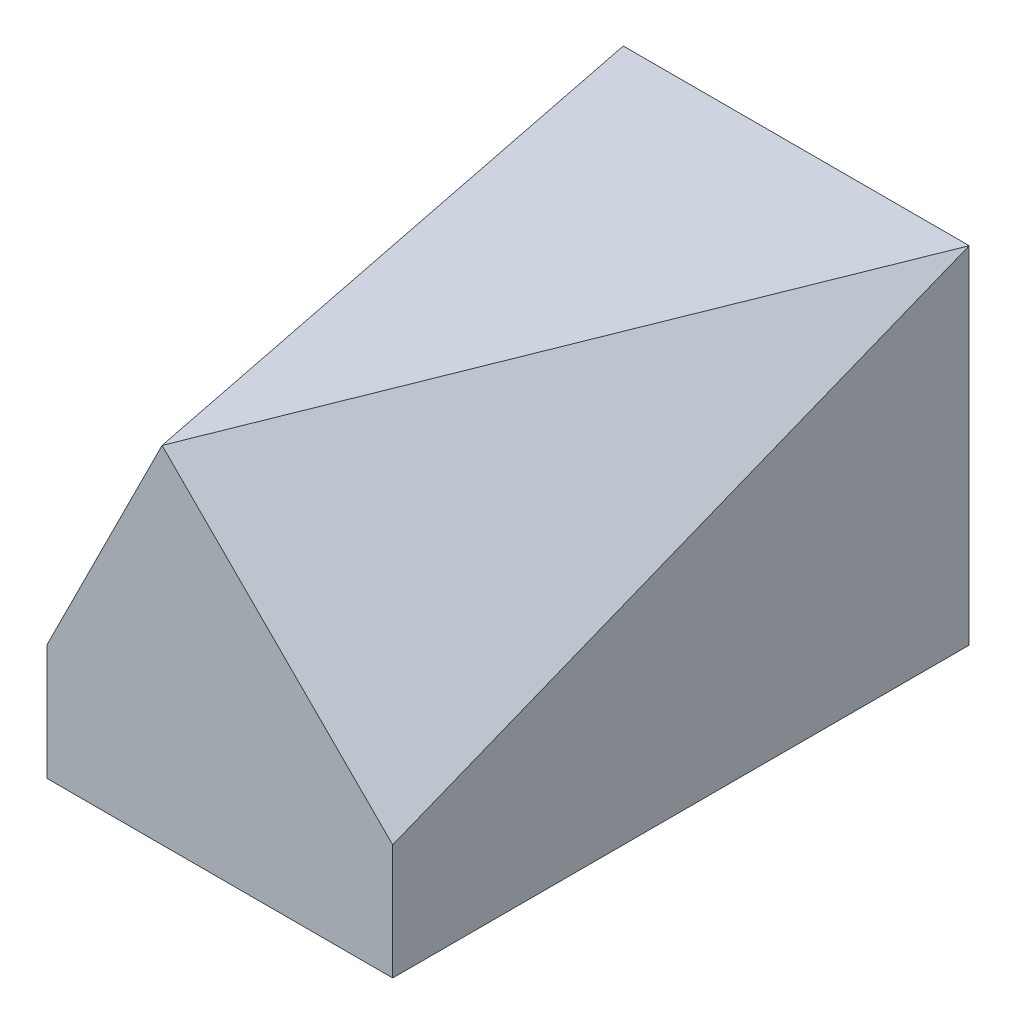
ISO-10303-21;
HEADER;
FILE_DESCRIPTION(('STEP AP214'),'2;1');
FILE_NAME('part.step','',(''),(''),'','','');
FILE_SCHEMA(('AUTOMOTIVE_DESIGN { 1 0 10303 214 1 1 1 1 }'));
ENDSEC;
DATA;
#1=APPLICATION_CONTEXT('core data for automotive mechanical design processes');
#2=APPLICATION_PROTOCOL_DEFINITION('international standard','automotive_design',2000,#1);
#3=PRODUCT_CONTEXT('',#1,'mechanical');
#4=PRODUCT('Part','Part','',(#3));
#5=PRODUCT_RELATED_PRODUCT_CATEGORY('part','',(#4));
#6=PRODUCT_DEFINITION_FORMATION('','',#4);
#7=PRODUCT_DEFINITION_CONTEXT('part definition',#1,'design');
#8=PRODUCT_DEFINITION('design','',#6,#7);
#9=PRODUCT_DEFINITION_SHAPE('','',#8);
#10=(LENGTH_UNIT() NAMED_UNIT(*) SI_UNIT(.MILLI.,.METRE.));
#11=(NAMED_UNIT(*) PLANE_ANGLE_UNIT() SI_UNIT($,.RADIAN.));
#12=(NAMED_UNIT(*) SI_UNIT($,.STERADIAN.) SOLID_ANGLE_UNIT());
#13=UNCERTAINTY_MEASURE_WITH_UNIT(LENGTH_MEASURE(1.E-05),#10,'distance_accuracy_value','');
#14=(GEOMETRIC_REPRESENTATION_CONTEXT(3) GLOBAL_UNCERTAINTY_ASSIGNED_CONTEXT((#13)) GLOBAL_UNIT_ASSIGNED_CONTEXT((#10,
#11,#12)) REPRESENTATION_CONTEXT('',''));
#15=CARTESIAN_POINT('',(0.,0.,0.));
#16=DIRECTION('',(0.,0.,1.));
#17=DIRECTION('',(1.,0.,0.));
#18=AXIS2_PLACEMENT_3D('',#15,#16,#17);
#19=CARTESIAN_POINT('',(-15.,30.,25.));
#20=DIRECTION('',(0.,0.,-1.));
#21=DIRECTION('',(-1.,0.,0.));
#22=AXIS2_PLACEMENT_3D('',#19,#20,#21);
#23=PLANE('',#22);
#24=DIRECTION('',(0.707106781186547,-0.707106781186547,0.));
#25=VECTOR('',#24,1.);
#26=CARTESIAN_POINT('',(-9.99999999999999,35.,25.));
#27=LINE('',#26,#25);
#28=CARTESIAN_POINT('',(-5.,30.,25.));
#29=VERTEX_POINT('',#28);
#30=CARTESIAN_POINT('',(15.,10.,25.));
#31=VERTEX_POINT('',#30);
#32=EDGE_CURVE('E110',#29,#31,#27,.T.);
#33=ORIENTED_EDGE('',*,*,#32,.F.);
#34=DIRECTION('',(-0.447213595499958,-0.894427190999916,0.));
#35=VECTOR('',#34,1.);
#36=CARTESIAN_POINT('',(-7.,26.,25.));
#37=LINE('',#36,#35);
#38=CARTESIAN_POINT('',(-15.,10.,25.));
#39=VERTEX_POINT('',#38);
#40=EDGE_CURVE('E11',#29,#39,#37,.T.);
#41=ORIENTED_EDGE('',*,*,#40,.T.);
#42=DIRECTION('',(0.,-1.,0.));
#43=VECTOR('',#42,1.);
#44=CARTESIAN_POINT('',(-15.,30.,25.));
#45=LINE('',#44,#43);
#46=CARTESIAN_POINT('',(-15.,0.,25.));
#47=VERTEX_POINT('',#46);
#48=EDGE_CURVE('E76',#39,#47,#45,.T.);
#49=ORIENTED_EDGE('',*,*,#48,.T.);
#50=DIRECTION('',(1.,0.,0.));
#51=VECTOR('',#50,1.);
#52=CARTESIAN_POINT('',(-15.,0.,25.));
#53=LINE('',#52,#51);
#54=CARTESIAN_POINT('',(15.,0.,25.));
#55=VERTEX_POINT('',#54);
#56=EDGE_CURVE('E81',#47,#55,#53,.T.);
#57=ORIENTED_EDGE('',*,*,#56,.T.);
#58=DIRECTION('',(0.,-1.,0.));
#59=VECTOR('',#58,1.);
#60=CARTESIAN_POINT('',(15.,30.,25.));
#61=LINE('',#60,#59);
#62=EDGE_CURVE('E85',#31,#55,#61,.T.);
#63=ORIENTED_EDGE('',*,*,#62,.F.);
#64=EDGE_LOOP('',(#33,#41,#49,#57,#63));
#65=FACE_BOUND('',#64,.T.);
#66=ADVANCED_FACE('F36',(#65),#23,.F.);
#67=CARTESIAN_POINT('',(-15.,30.,-25.));
#68=DIRECTION('',(1.,0.,0.));
#69=DIRECTION('',(0.,0.,-1.));
#70=AXIS2_PLACEMENT_3D('',#67,#68,#69);
#71=PLANE('',#70);
#72=ORIENTED_EDGE('',*,*,#48,.F.);
#73=DIRECTION('',(0.,0.371390676354104,-0.928476690885259));
#74=VECTOR('',#73,1.);
#75=CARTESIAN_POINT('',(-15.,30.,-25.));
#76=LINE('',#75,#74);
#77=CARTESIAN_POINT('',(-15.,30.,-25.));
#78=VERTEX_POINT('',#77);
#79=EDGE_CURVE('E44',#39,#78,#76,.T.);
#80=ORIENTED_EDGE('',*,*,#79,.T.);
#81=DIRECTION('',(0.,-1.,0.));
#82=VECTOR('',#81,1.);
#83=CARTESIAN_POINT('',(-15.,30.,-25.));
#84=LINE('',#83,#82);
#85=CARTESIAN_POINT('',(-15.,0.,-25.));
#86=VERTEX_POINT('',#85);
#87=EDGE_CURVE('E84',#78,#86,#84,.T.);
#88=ORIENTED_EDGE('',*,*,#87,.T.);
#89=DIRECTION('',(0.,0.,1.));
#90=VECTOR('',#89,1.);
#91=CARTESIAN_POINT('',(-15.,0.,-25.));
#92=LINE('',#91,#90);
#93=EDGE_CURVE('E89',#86,#47,#92,.T.);
#94=ORIENTED_EDGE('',*,*,#93,.T.);
#95=EDGE_LOOP('',(#72,#80,#88,#94));
#96=FACE_BOUND('',#95,.T.);
#97=ADVANCED_FACE('F90',(#96),#71,.F.);
#98=CARTESIAN_POINT('',(0.,30.,0.));
#99=DIRECTION('',(0.,1.,0.));
#100=DIRECTION('',(0.,0.,1.));
#101=AXIS2_PLACEMENT_3D('',#98,#99,#100);
#102=PLANE('',#101);
#103=DIRECTION('',(-0.196116135138184,0.,-0.98058067569092));
#104=VECTOR('',#103,1.);
#105=CARTESIAN_POINT('',(-9.61538461538461,30.,1.92307692307692));
#106=LINE('',#105,#104);
#107=EDGE_CURVE('E114',#29,#78,#106,.T.);
#108=ORIENTED_EDGE('',*,*,#107,.F.);
#109=DIRECTION('',(0.371390676354104,0.,-0.928476690885259));
#110=VECTOR('',#109,1.);
#111=CARTESIAN_POINT('',(4.31034482758622,30.,1.72413793103449));
#112=LINE('',#111,#110);
#113=CARTESIAN_POINT('',(15.,30.,-25.));
#114=VERTEX_POINT('',#113);
#115=EDGE_CURVE('E112',#29,#114,#112,.T.);
#116=ORIENTED_EDGE('',*,*,#115,.T.);
#117=DIRECTION('',(-1.,0.,0.));
#118=VECTOR('',#117,1.);
#119=CARTESIAN_POINT('',(-15.,30.,-25.));
#120=LINE('',#119,#118);
#121=EDGE_CURVE('E98',#114,#78,#120,.T.);
#122=ORIENTED_EDGE('',*,*,#121,.T.);
#123=EDGE_LOOP('',(#108,#116,#122));
#124=FACE_BOUND('',#123,.T.);
#125=ADVANCED_FACE('F120',(#124),#102,.T.);
#126=CARTESIAN_POINT('',(15.,30.,-25.));
#127=DIRECTION('',(-1.,0.,0.));
#128=DIRECTION('',(0.,0.,1.));
#129=AXIS2_PLACEMENT_3D('',#126,#127,#128);
#130=PLANE('',#129);
#131=DIRECTION('',(0.,0.371390676354104,-0.928476690885259));
#132=VECTOR('',#131,1.);
#133=CARTESIAN_POINT('',(15.,30.,-25.));
#134=LINE('',#133,#132);
#135=EDGE_CURVE('E58',#31,#114,#134,.T.);
#136=ORIENTED_EDGE('',*,*,#135,.F.);
#137=ORIENTED_EDGE('',*,*,#62,.T.);
#138=DIRECTION('',(0.,0.,-1.));
#139=VECTOR('',#138,1.);
#140=CARTESIAN_POINT('',(15.,0.,-25.));
#141=LINE('',#140,#139);
#142=CARTESIAN_POINT('',(15.,0.,-25.));
#143=VERTEX_POINT('',#142);
#144=EDGE_CURVE('E97',#55,#143,#141,.T.);
#145=ORIENTED_EDGE('',*,*,#144,.T.);
#146=DIRECTION('',(0.,-1.,0.));
#147=VECTOR('',#146,1.);
#148=CARTESIAN_POINT('',(15.,30.,-25.));
#149=LINE('',#148,#147);
#150=EDGE_CURVE('E106',#114,#143,#149,.T.);
#151=ORIENTED_EDGE('',*,*,#150,.F.);
#152=EDGE_LOOP('',(#136,#137,#145,#151));
#153=FACE_BOUND('',#152,.T.);
#154=ADVANCED_FACE('F38',(#153),#130,.F.);
#155=CARTESIAN_POINT('',(-15.,30.,-25.));
#156=DIRECTION('',(0.,0.,1.));
#157=DIRECTION('',(1.,0.,0.));
#158=AXIS2_PLACEMENT_3D('',#155,#156,#157);
#159=PLANE('',#158);
#160=DIRECTION('',(-1.,0.,0.));
#161=VECTOR('',#160,1.);
#162=CARTESIAN_POINT('',(-15.,0.,-25.));
#163=LINE('',#162,#161);
#164=EDGE_CURVE('E93',#143,#86,#163,.T.);
#165=ORIENTED_EDGE('',*,*,#164,.T.);
#166=ORIENTED_EDGE('',*,*,#87,.F.);
#167=ORIENTED_EDGE('',*,*,#121,.F.);
#168=ORIENTED_EDGE('',*,*,#150,.T.);
#169=EDGE_LOOP('',(#165,#166,#167,#168));
#170=FACE_BOUND('',#169,.T.);
#171=ADVANCED_FACE('F123',(#170),#159,.F.);
#172=CARTESIAN_POINT('',(0.,0.,0.));
#173=DIRECTION('',(0.,1.,0.));
#174=DIRECTION('',(0.,0.,1.));
#175=AXIS2_PLACEMENT_3D('',#172,#173,#174);
#176=PLANE('',#175);
#177=ORIENTED_EDGE('',*,*,#144,.F.);
#178=ORIENTED_EDGE('',*,*,#56,.F.);
#179=ORIENTED_EDGE('',*,*,#93,.F.);
#180=ORIENTED_EDGE('',*,*,#164,.F.);
#181=EDGE_LOOP('',(#177,#178,#179,#180));
#182=FACE_BOUND('',#181,.T.);
#183=ADVANCED_FACE('F95',(#182),#176,.F.);
#184=CARTESIAN_POINT('',(16.2037037037037,16.2037037037037,6.48148148148148));
#185=DIRECTION('',(0.680413817439772,0.680413817439772,0.272165526975909));
#186=DIRECTION('',(-0.707106781186547,0.707106781186547,0.));
#187=AXIS2_PLACEMENT_3D('',#184,#185,#186);
#188=PLANE('',#187);
#189=ORIENTED_EDGE('',*,*,#32,.T.);
#190=ORIENTED_EDGE('',*,*,#135,.T.);
#191=ORIENTED_EDGE('',*,*,#115,.F.);
#192=EDGE_LOOP('',(#189,#190,#191));
#193=FACE_BOUND('',#192,.T.);
#194=ADVANCED_FACE('F126',(#193),#188,.T.);
#195=CARTESIAN_POINT('',(-19.3798449612403,9.68992248062015,3.87596899224807));
#196=DIRECTION('',(0.880450906325624,-0.440225453162812,-0.176090181265125));
#197=DIRECTION('',(0.447213595499958,0.894427190999916,0.));
#198=AXIS2_PLACEMENT_3D('',#195,#196,#197);
#199=PLANE('',#198);
#200=ORIENTED_EDGE('',*,*,#40,.F.);
#201=ORIENTED_EDGE('',*,*,#107,.T.);
#202=ORIENTED_EDGE('',*,*,#79,.F.);
#203=EDGE_LOOP('',(#200,#201,#202));
#204=FACE_BOUND('',#203,.T.);
#205=ADVANCED_FACE('F128',(#204),#199,.F.);
#206=CLOSED_SHELL('',(#66,#97,#125,#154,#171,#183,#194,#205));
#207=MANIFOLD_SOLID_BREP('B2',#206);
#208=ADVANCED_BREP_SHAPE_REPRESENTATION('',(#18,#207),#14);
#209=SHAPE_DEFINITION_REPRESENTATION(#9,#208);
ENDSEC;
END-ISO-10303-21;
